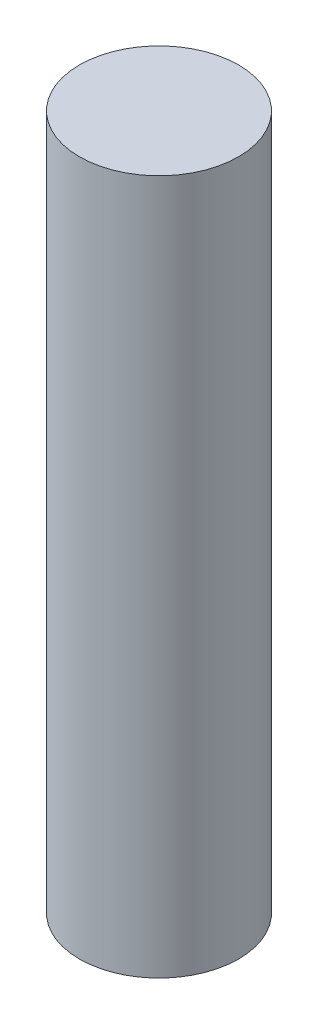
ISO-10303-21;
HEADER;
FILE_DESCRIPTION(('STEP AP214'),'2;1');
FILE_NAME('part.step','',(''),(''),'','','');
FILE_SCHEMA(('AUTOMOTIVE_DESIGN { 1 0 10303 214 1 1 1 1 }'));
ENDSEC;
DATA;
#1=APPLICATION_CONTEXT('core data for automotive mechanical design processes');
#2=APPLICATION_PROTOCOL_DEFINITION('international standard','automotive_design',2000,#1);
#3=PRODUCT_CONTEXT('',#1,'mechanical');
#4=PRODUCT('Part','Part','',(#3));
#5=PRODUCT_RELATED_PRODUCT_CATEGORY('part','',(#4));
#6=PRODUCT_DEFINITION_FORMATION('','',#4);
#7=PRODUCT_DEFINITION_CONTEXT('part definition',#1,'design');
#8=PRODUCT_DEFINITION('design','',#6,#7);
#9=PRODUCT_DEFINITION_SHAPE('','',#8);
#10=(LENGTH_UNIT() NAMED_UNIT(*) SI_UNIT(.MILLI.,.METRE.));
#11=(NAMED_UNIT(*) PLANE_ANGLE_UNIT() SI_UNIT($,.RADIAN.));
#12=(NAMED_UNIT(*) SI_UNIT($,.STERADIAN.) SOLID_ANGLE_UNIT());
#13=UNCERTAINTY_MEASURE_WITH_UNIT(LENGTH_MEASURE(1.E-05),#10,'distance_accuracy_value','');
#14=(GEOMETRIC_REPRESENTATION_CONTEXT(3) GLOBAL_UNCERTAINTY_ASSIGNED_CONTEXT((#13)) GLOBAL_UNIT_ASSIGNED_CONTEXT((#10,
#11,#12)) REPRESENTATION_CONTEXT('',''));
#15=CARTESIAN_POINT('',(0.,0.,0.));
#16=DIRECTION('',(0.,0.,1.));
#17=DIRECTION('',(1.,0.,0.));
#18=AXIS2_PLACEMENT_3D('',#15,#16,#17);
#19=CARTESIAN_POINT('',(0.,655.,0.));
#20=DIRECTION('',(0.,-1.,0.));
#21=DIRECTION('',(0.,0.,-1.));
#22=AXIS2_PLACEMENT_3D('',#19,#20,#21);
#23=CYLINDRICAL_SURFACE('',#22,75.);
#24=CARTESIAN_POINT('',(0.,655.,0.));
#25=DIRECTION('',(0.,1.,0.));
#26=DIRECTION('',(0.,0.,1.));
#27=AXIS2_PLACEMENT_3D('',#24,#25,#26);
#28=CIRCLE('',#27,75.);
#29=CARTESIAN_POINT('',(0.,655.,75.));
#30=VERTEX_POINT('',#29);
#31=EDGE_CURVE('E10',#30,#30,#28,.T.);
#32=ORIENTED_EDGE('',*,*,#31,.F.);
#33=EDGE_LOOP('',(#32));
#34=FACE_BOUND('',#33,.T.);
#35=CARTESIAN_POINT('',(0.,0.,0.));
#36=DIRECTION('',(0.,1.,0.));
#37=DIRECTION('',(0.,0.,1.));
#38=AXIS2_PLACEMENT_3D('',#35,#36,#37);
#39=CIRCLE('',#38,75.);
#40=CARTESIAN_POINT('',(0.,0.,75.));
#41=VERTEX_POINT('',#40);
#42=EDGE_CURVE('E44',#41,#41,#39,.T.);
#43=ORIENTED_EDGE('',*,*,#42,.T.);
#44=EDGE_LOOP('',(#43));
#45=FACE_BOUND('',#44,.T.);
#46=ADVANCED_FACE('F41',(#34,#45),#23,.T.);
#47=CARTESIAN_POINT('',(0.,655.,0.));
#48=DIRECTION('',(0.,1.,0.));
#49=DIRECTION('',(0.,0.,1.));
#50=AXIS2_PLACEMENT_3D('',#47,#48,#49);
#51=PLANE('',#50);
#52=ORIENTED_EDGE('',*,*,#31,.T.);
#53=EDGE_LOOP('',(#52));
#54=FACE_BOUND('',#53,.T.);
#55=ADVANCED_FACE('F58',(#54),#51,.T.);
#56=CARTESIAN_POINT('',(0.,0.,0.));
#57=DIRECTION('',(0.,1.,0.));
#58=DIRECTION('',(0.,0.,1.));
#59=AXIS2_PLACEMENT_3D('',#56,#57,#58);
#60=PLANE('',#59);
#61=ORIENTED_EDGE('',*,*,#42,.F.);
#62=EDGE_LOOP('',(#61));
#63=FACE_BOUND('',#62,.T.);
#64=ADVANCED_FACE('F56',(#63),#60,.F.);
#65=CLOSED_SHELL('',(#46,#55,#64));
#66=MANIFOLD_SOLID_BREP('B2',#65);
#67=ADVANCED_BREP_SHAPE_REPRESENTATION('',(#18,#66),#14);
#68=SHAPE_DEFINITION_REPRESENTATION(#9,#67);
ENDSEC;
END-ISO-10303-21;
